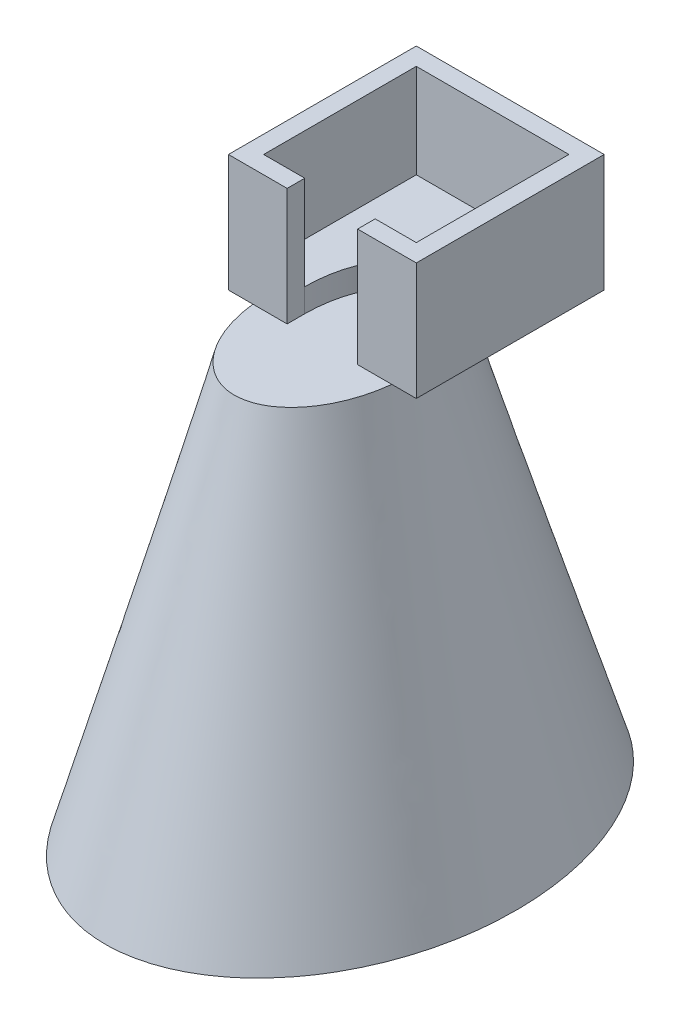
ISO-10303-21;
HEADER;
FILE_DESCRIPTION(('STEP AP214'),'2;1');
FILE_NAME('part.step','',(''),(''),'','','');
FILE_SCHEMA(('AUTOMOTIVE_DESIGN { 1 0 10303 214 1 1 1 1 }'));
ENDSEC;
DATA;
#1=APPLICATION_CONTEXT('core data for automotive mechanical design processes');
#2=APPLICATION_PROTOCOL_DEFINITION('international standard','automotive_design',2000,#1);
#3=PRODUCT_CONTEXT('',#1,'mechanical');
#4=PRODUCT('Part','Part','',(#3));
#5=PRODUCT_RELATED_PRODUCT_CATEGORY('part','',(#4));
#6=PRODUCT_DEFINITION_FORMATION('','',#4);
#7=PRODUCT_DEFINITION_CONTEXT('part definition',#1,'design');
#8=PRODUCT_DEFINITION('design','',#6,#7);
#9=PRODUCT_DEFINITION_SHAPE('','',#8);
#10=(LENGTH_UNIT() NAMED_UNIT(*) SI_UNIT(.MILLI.,.METRE.));
#11=(NAMED_UNIT(*) PLANE_ANGLE_UNIT() SI_UNIT($,.RADIAN.));
#12=(NAMED_UNIT(*) SI_UNIT($,.STERADIAN.) SOLID_ANGLE_UNIT());
#13=UNCERTAINTY_MEASURE_WITH_UNIT(LENGTH_MEASURE(1.E-05),#10,'distance_accuracy_value','');
#14=(GEOMETRIC_REPRESENTATION_CONTEXT(3) GLOBAL_UNCERTAINTY_ASSIGNED_CONTEXT((#13)) GLOBAL_UNIT_ASSIGNED_CONTEXT((#10,
#11,#12)) REPRESENTATION_CONTEXT('',''));
#15=CARTESIAN_POINT('',(0.,0.,0.));
#16=DIRECTION('',(0.,0.,1.));
#17=DIRECTION('',(1.,0.,0.));
#18=AXIS2_PLACEMENT_3D('',#15,#16,#17);
#19=CARTESIAN_POINT('',(-7.99999999999999,10.,8.));
#20=DIRECTION('',(0.,0.,-1.));
#21=DIRECTION('',(-1.,0.,0.));
#22=AXIS2_PLACEMENT_3D('',#19,#20,#21);
#23=PLANE('',#22);
#24=DIRECTION('',(0.,-1.,0.));
#25=VECTOR('',#24,1.);
#26=CARTESIAN_POINT('',(3.00000000000001,20.,8.));
#27=LINE('',#26,#25);
#28=CARTESIAN_POINT('',(3.00000000000001,10.,8.));
#29=VERTEX_POINT('',#28);
#30=CARTESIAN_POINT('',(3.00000000000001,0.,8.));
#31=VERTEX_POINT('',#30);
#32=EDGE_CURVE('E201',#29,#31,#27,.T.);
#33=ORIENTED_EDGE('',*,*,#32,.T.);
#34=DIRECTION('',(1.,0.,0.));
#35=VECTOR('',#34,1.);
#36=CARTESIAN_POINT('',(-7.99999999999999,0.,8.));
#37=LINE('',#36,#35);
#38=CARTESIAN_POINT('',(5.91632663334496,0.,7.9999661761987));
#39=VERTEX_POINT('',#38);
#40=EDGE_CURVE('E178',#31,#39,#37,.T.);
#41=ORIENTED_EDGE('',*,*,#40,.T.);
#42=CARTESIAN_POINT('',(8.00000000000001,0.,8.));
#43=VERTEX_POINT('',#42);
#44=EDGE_CURVE('E189',#39,#43,#37,.T.);
#45=ORIENTED_EDGE('',*,*,#44,.T.);
#46=DIRECTION('',(0.,-1.,0.));
#47=VECTOR('',#46,1.);
#48=CARTESIAN_POINT('',(8.00000000000001,10.,8.));
#49=LINE('',#48,#47);
#50=CARTESIAN_POINT('',(8.00000000000001,10.,8.));
#51=VERTEX_POINT('',#50);
#52=EDGE_CURVE('E214',#51,#43,#49,.T.);
#53=ORIENTED_EDGE('',*,*,#52,.F.);
#54=DIRECTION('',(1.,0.,0.));
#55=VECTOR('',#54,1.);
#56=CARTESIAN_POINT('',(-7.99999999999999,10.,8.));
#57=LINE('',#56,#55);
#58=EDGE_CURVE('E240',#29,#51,#57,.T.);
#59=ORIENTED_EDGE('',*,*,#58,.F.);
#60=EDGE_LOOP('',(#33,#41,#45,#53,#59));
#61=FACE_BOUND('',#60,.T.);
#62=ADVANCED_FACE('F61',(#61),#23,.F.);
#63=CARTESIAN_POINT('',(-6.5,2.,6.5));
#64=DIRECTION('',(0.,0.,1.));
#65=DIRECTION('',(1.,0.,0.));
#66=AXIS2_PLACEMENT_3D('',#63,#64,#65);
#67=PLANE('',#66);
#68=DIRECTION('',(0.,-1.,0.));
#69=VECTOR('',#68,1.);
#70=CARTESIAN_POINT('',(3.,20.,6.5));
#71=LINE('',#70,#69);
#72=CARTESIAN_POINT('',(3.,10.,6.5));
#73=VERTEX_POINT('',#72);
#74=CARTESIAN_POINT('',(3.,2.,6.5));
#75=VERTEX_POINT('',#74);
#76=EDGE_CURVE('E360',#73,#75,#71,.T.);
#77=ORIENTED_EDGE('',*,*,#76,.F.);
#78=DIRECTION('',(1.,0.,0.));
#79=VECTOR('',#78,1.);
#80=CARTESIAN_POINT('',(-6.5,10.,6.5));
#81=LINE('',#80,#79);
#82=CARTESIAN_POINT('',(6.5,10.,6.5));
#83=VERTEX_POINT('',#82);
#84=EDGE_CURVE('E277',#73,#83,#81,.T.);
#85=ORIENTED_EDGE('',*,*,#84,.T.);
#86=DIRECTION('',(0.,1.,0.));
#87=VECTOR('',#86,1.);
#88=CARTESIAN_POINT('',(6.5,2.,6.5));
#89=LINE('',#88,#87);
#90=CARTESIAN_POINT('',(6.5,2.,6.5));
#91=VERTEX_POINT('',#90);
#92=EDGE_CURVE('E247',#91,#83,#89,.T.);
#93=ORIENTED_EDGE('',*,*,#92,.F.);
#94=DIRECTION('',(1.,0.,0.));
#95=VECTOR('',#94,1.);
#96=CARTESIAN_POINT('',(-6.5,2.,6.5));
#97=LINE('',#96,#95);
#98=EDGE_CURVE('E306',#75,#91,#97,.T.);
#99=ORIENTED_EDGE('',*,*,#98,.F.);
#100=EDGE_LOOP('',(#77,#85,#93,#99));
#101=FACE_BOUND('',#100,.T.);
#102=ADVANCED_FACE('F395',(#101),#67,.F.);
#103=CARTESIAN_POINT('',(8.,10.,-8.));
#104=DIRECTION('',(-1.,0.,0.));
#105=DIRECTION('',(0.,0.,1.));
#106=AXIS2_PLACEMENT_3D('',#103,#104,#105);
#107=PLANE('',#106);
#108=DIRECTION('',(0.,0.,-1.));
#109=VECTOR('',#108,1.);
#110=CARTESIAN_POINT('',(8.,0.,-8.));
#111=LINE('',#110,#109);
#112=CARTESIAN_POINT('',(8.,0.,-8.));
#113=VERTEX_POINT('',#112);
#114=EDGE_CURVE('E192',#43,#113,#111,.T.);
#115=ORIENTED_EDGE('',*,*,#114,.T.);
#116=DIRECTION('',(0.,-1.,0.));
#117=VECTOR('',#116,1.);
#118=CARTESIAN_POINT('',(8.,10.,-8.));
#119=LINE('',#118,#117);
#120=CARTESIAN_POINT('',(8.,10.,-8.));
#121=VERTEX_POINT('',#120);
#122=EDGE_CURVE('E77',#121,#113,#119,.T.);
#123=ORIENTED_EDGE('',*,*,#122,.F.);
#124=DIRECTION('',(0.,0.,-1.));
#125=VECTOR('',#124,1.);
#126=CARTESIAN_POINT('',(8.,10.,-8.));
#127=LINE('',#126,#125);
#128=EDGE_CURVE('E221',#51,#121,#127,.T.);
#129=ORIENTED_EDGE('',*,*,#128,.F.);
#130=ORIENTED_EDGE('',*,*,#52,.T.);
#131=EDGE_LOOP('',(#115,#123,#129,#130));
#132=FACE_BOUND('',#131,.T.);
#133=ADVANCED_FACE('F63',(#132),#107,.F.);
#134=CARTESIAN_POINT('',(-8.,10.,-8.));
#135=DIRECTION('',(0.,0.,1.));
#136=DIRECTION('',(1.,0.,0.));
#137=AXIS2_PLACEMENT_3D('',#134,#135,#136);
#138=PLANE('',#137);
#139=DIRECTION('',(-1.,0.,0.));
#140=VECTOR('',#139,1.);
#141=CARTESIAN_POINT('',(-8.,0.,-8.));
#142=LINE('',#141,#140);
#143=CARTESIAN_POINT('',(-8.,0.,-8.));
#144=VERTEX_POINT('',#143);
#145=EDGE_CURVE('E246',#113,#144,#142,.T.);
#146=ORIENTED_EDGE('',*,*,#145,.T.);
#147=DIRECTION('',(0.,-1.,0.));
#148=VECTOR('',#147,1.);
#149=CARTESIAN_POINT('',(-8.,10.,-8.));
#150=LINE('',#149,#148);
#151=CARTESIAN_POINT('',(-8.,10.,-8.));
#152=VERTEX_POINT('',#151);
#153=EDGE_CURVE('E261',#152,#144,#150,.T.);
#154=ORIENTED_EDGE('',*,*,#153,.F.);
#155=DIRECTION('',(-1.,0.,0.));
#156=VECTOR('',#155,1.);
#157=CARTESIAN_POINT('',(-8.,10.,-8.));
#158=LINE('',#157,#156);
#159=EDGE_CURVE('E226',#121,#152,#158,.T.);
#160=ORIENTED_EDGE('',*,*,#159,.F.);
#161=ORIENTED_EDGE('',*,*,#122,.T.);
#162=EDGE_LOOP('',(#146,#154,#160,#161));
#163=FACE_BOUND('',#162,.T.);
#164=ADVANCED_FACE('F269',(#163),#138,.F.);
#165=CARTESIAN_POINT('',(-8.,10.,-8.));
#166=DIRECTION('',(1.,0.,0.));
#167=DIRECTION('',(0.,0.,-1.));
#168=AXIS2_PLACEMENT_3D('',#165,#166,#167);
#169=PLANE('',#168);
#170=DIRECTION('',(0.,0.,1.));
#171=VECTOR('',#170,1.);
#172=CARTESIAN_POINT('',(-8.,0.,-8.));
#173=LINE('',#172,#171);
#174=CARTESIAN_POINT('',(-7.99999999999999,0.,8.));
#175=VERTEX_POINT('',#174);
#176=EDGE_CURVE('E197',#144,#175,#173,.T.);
#177=ORIENTED_EDGE('',*,*,#176,.T.);
#178=DIRECTION('',(0.,-1.,0.));
#179=VECTOR('',#178,1.);
#180=CARTESIAN_POINT('',(-7.99999999999999,10.,8.));
#181=LINE('',#180,#179);
#182=CARTESIAN_POINT('',(-7.99999999999999,10.,8.));
#183=VERTEX_POINT('',#182);
#184=EDGE_CURVE('E259',#183,#175,#181,.T.);
#185=ORIENTED_EDGE('',*,*,#184,.F.);
#186=DIRECTION('',(0.,0.,1.));
#187=VECTOR('',#186,1.);
#188=CARTESIAN_POINT('',(-8.,10.,-8.));
#189=LINE('',#188,#187);
#190=EDGE_CURVE('E232',#152,#183,#189,.T.);
#191=ORIENTED_EDGE('',*,*,#190,.F.);
#192=ORIENTED_EDGE('',*,*,#153,.T.);
#193=EDGE_LOOP('',(#177,#185,#191,#192));
#194=FACE_BOUND('',#193,.T.);
#195=ADVANCED_FACE('F257',(#194),#169,.F.);
#196=CARTESIAN_POINT('',(-5.91632824516334,0.,7.99996585064522));
#197=VERTEX_POINT('',#196);
#198=EDGE_CURVE('E205',#175,#197,#37,.T.);
#199=ORIENTED_EDGE('',*,*,#198,.T.);
#200=CARTESIAN_POINT('',(-2.99999999999999,0.,8.));
#201=VERTEX_POINT('',#200);
#202=EDGE_CURVE('E181',#197,#201,#37,.T.);
#203=ORIENTED_EDGE('',*,*,#202,.T.);
#204=DIRECTION('',(0.,-1.,0.));
#205=VECTOR('',#204,1.);
#206=CARTESIAN_POINT('',(-2.99999999999999,20.,8.));
#207=LINE('',#206,#205);
#208=CARTESIAN_POINT('',(-2.99999999999999,10.,8.));
#209=VERTEX_POINT('',#208);
#210=EDGE_CURVE('E357',#209,#201,#207,.T.);
#211=ORIENTED_EDGE('',*,*,#210,.F.);
#212=EDGE_CURVE('E241',#183,#209,#57,.T.);
#213=ORIENTED_EDGE('',*,*,#212,.F.);
#214=ORIENTED_EDGE('',*,*,#184,.T.);
#215=EDGE_LOOP('',(#199,#203,#211,#213,#214));
#216=FACE_BOUND('',#215,.T.);
#217=ADVANCED_FACE('F262',(#216),#23,.F.);
#218=CARTESIAN_POINT('',(0.,10.,0.));
#219=DIRECTION('',(0.,1.,0.));
#220=DIRECTION('',(0.,0.,1.));
#221=AXIS2_PLACEMENT_3D('',#218,#219,#220);
#222=PLANE('',#221);
#223=DIRECTION('',(0.,0.,1.));
#224=VECTOR('',#223,1.);
#225=CARTESIAN_POINT('',(-2.99999999999999,10.,0.));
#226=LINE('',#225,#224);
#227=CARTESIAN_POINT('',(-2.99999999999999,10.,6.5));
#228=VERTEX_POINT('',#227);
#229=EDGE_CURVE('E282',#228,#209,#226,.T.);
#230=ORIENTED_EDGE('',*,*,#229,.F.);
#231=CARTESIAN_POINT('',(-6.5,10.,6.5));
#232=VERTEX_POINT('',#231);
#233=EDGE_CURVE('E298',#232,#228,#81,.T.);
#234=ORIENTED_EDGE('',*,*,#233,.F.);
#235=DIRECTION('',(0.,0.,1.));
#236=VECTOR('',#235,1.);
#237=CARTESIAN_POINT('',(-6.5,10.,-6.5));
#238=LINE('',#237,#236);
#239=CARTESIAN_POINT('',(-6.5,10.,-6.5));
#240=VERTEX_POINT('',#239);
#241=EDGE_CURVE('E317',#240,#232,#238,.T.);
#242=ORIENTED_EDGE('',*,*,#241,.F.);
#243=DIRECTION('',(-1.,0.,0.));
#244=VECTOR('',#243,1.);
#245=CARTESIAN_POINT('',(-6.5,10.,-6.5));
#246=LINE('',#245,#244);
#247=CARTESIAN_POINT('',(6.5,10.,-6.5));
#248=VERTEX_POINT('',#247);
#249=EDGE_CURVE('E313',#248,#240,#246,.T.);
#250=ORIENTED_EDGE('',*,*,#249,.F.);
#251=DIRECTION('',(0.,0.,-1.));
#252=VECTOR('',#251,1.);
#253=CARTESIAN_POINT('',(6.5,10.,-6.5));
#254=LINE('',#253,#252);
#255=EDGE_CURVE('E92',#83,#248,#254,.T.);
#256=ORIENTED_EDGE('',*,*,#255,.F.);
#257=ORIENTED_EDGE('',*,*,#84,.F.);
#258=DIRECTION('',(0.,0.,1.));
#259=VECTOR('',#258,1.);
#260=CARTESIAN_POINT('',(3.,10.,0.));
#261=LINE('',#260,#259);
#262=EDGE_CURVE('E276',#73,#29,#261,.T.);
#263=ORIENTED_EDGE('',*,*,#262,.T.);
#264=ORIENTED_EDGE('',*,*,#58,.T.);
#265=ORIENTED_EDGE('',*,*,#128,.T.);
#266=ORIENTED_EDGE('',*,*,#159,.T.);
#267=ORIENTED_EDGE('',*,*,#190,.T.);
#268=ORIENTED_EDGE('',*,*,#212,.T.);
#269=EDGE_LOOP('',(#230,#234,#242,#250,#256,#257,#263,#264,#265,#266,#267,#268));
#270=FACE_BOUND('',#269,.T.);
#271=ADVANCED_FACE('F274',(#270),#222,.T.);
#272=CARTESIAN_POINT('',(0.,0.,0.));
#273=DIRECTION('',(0.,1.,0.));
#274=DIRECTION('',(0.,0.,1.));
#275=AXIS2_PLACEMENT_3D('',#272,#273,#274);
#276=PLANE('',#275);
#277=ORIENTED_EDGE('',*,*,#44,.F.);
#278=CARTESIAN_POINT('',(5.91608664185094,0.,7.9999391333498));
#279=CARTESIAN_POINT('',(5.94017140288235,0.,7.78609038024352));
#280=CARTESIAN_POINT('',(5.95904546552678,0.,7.57166052341323));
#281=CARTESIAN_POINT('',(5.98644391586068,0.,7.14207451848397));
#282=CARTESIAN_POINT('',(5.99496516333955,0.,6.92691816985995));
#283=CARTESIAN_POINT('',(6.00171566487025,0.,6.49641442115934));
#284=CARTESIAN_POINT('',(5.99994343733068,0.,6.28106699804075));
#285=CARTESIAN_POINT('',(5.98603198853717,0.,5.84894008244443));
#286=CARTESIAN_POINT('',(5.97380795969563,0.,5.63216331019717));
#287=CARTESIAN_POINT('',(5.93880395442882,0.,5.19947922080942));
#288=CARTESIAN_POINT('',(5.91602494936533,0.,4.98357182550513));
#289=CARTESIAN_POINT('',(5.85976767065591,0.,4.55317921094382));
#290=CARTESIAN_POINT('',(5.82629034471933,0.,4.33869386743178));
#291=CARTESIAN_POINT('',(5.73473808088342,0.,3.83668621608732));
#292=CARTESIAN_POINT('',(5.6721535719133,0.,3.54997050537042));
#293=CARTESIAN_POINT('',(5.52629851549188,0.,2.98179871601563));
#294=CARTESIAN_POINT('',(5.44302601357507,0.,2.7003431370232));
#295=CARTESIAN_POINT('',(5.2550291978857,0.,2.1454472991375));
#296=CARTESIAN_POINT('',(5.15036003180417,0.,1.87198846019565));
#297=CARTESIAN_POINT('',(4.91820659509148,0.,1.33495666926248));
#298=CARTESIAN_POINT('',(4.79073240526889,0.,1.07137941120226));
#299=CARTESIAN_POINT('',(4.55859307485381,0.,0.644105355367625));
#300=CARTESIAN_POINT('',(4.4607297626715,0.,0.47669705296395));
#301=CARTESIAN_POINT('',(4.25383408452357,0.,0.148859599975521));
#302=CARTESIAN_POINT('',(4.14480018571711,0.,-0.0115685884752345));
#303=CARTESIAN_POINT('',(3.91521777880357,0.,-0.323769748141769));
#304=CARTESIAN_POINT('',(3.79468119884094,0.,-0.475551430290298));
#305=CARTESIAN_POINT('',(3.54168515895169,0.,-0.768741794228157));
#306=CARTESIAN_POINT('',(3.40922812990479,0.,-0.910152580277381));
#307=CARTESIAN_POINT('',(3.06135102671966,0.,-1.24939373818852));
#308=CARTESIAN_POINT('',(2.83798631049277,0.,-1.43936147917797));
#309=CARTESIAN_POINT('',(2.48271078916535,0.,-1.69574523783265));
#310=CARTESIAN_POINT('',(2.36093706763078,0.,-1.77643366972574));
#311=CARTESIAN_POINT('',(2.11086872129758,0.,-1.92705830771189));
#312=CARTESIAN_POINT('',(1.98257534415352,0.,-1.99699656081369));
#313=CARTESIAN_POINT('',(1.74363514933324,0.,-2.11326119066615));
#314=CARTESIAN_POINT('',(1.63395124909799,0.,-2.16157263734053));
#315=CARTESIAN_POINT('',(1.41107863866039,0.,-2.249272667177));
#316=CARTESIAN_POINT('',(1.29789065988021,0.,-2.28866309837779));
#317=CARTESIAN_POINT('',(1.06866493694978,0.,-2.3578289857586));
#318=CARTESIAN_POINT('',(0.952628623153739,0.,-2.38760916578779));
#319=CARTESIAN_POINT('',(0.718400706734653,0.,-2.43701529594141));
#320=CARTESIAN_POINT('',(0.600209035740107,0.,-2.45664092336453));
#321=CARTESIAN_POINT('',(0.362080539108123,0.,-2.48539067028169));
#322=CARTESIAN_POINT('',(0.242138698238753,0.,-2.4944734469646));
#323=CARTESIAN_POINT('',(0.00193511867273593,0.,-2.50180291614116));
#324=CARTESIAN_POINT('',(-0.118326586138922,0.,-2.500050714058));
#325=CARTESIAN_POINT('',(-0.358192444726062,0.,-2.48575178762662));
#326=CARTESIAN_POINT('',(-0.477796655927855,0.,-2.47320602157589));
#327=CARTESIAN_POINT('',(-0.715475067026538,0.,-2.43757930030882));
#328=CARTESIAN_POINT('',(-0.833548558487565,0.,-2.41449363436568));
#329=CARTESIAN_POINT('',(-1.06054622191114,0.,-2.35987031831218));
#330=CARTESIAN_POINT('',(-1.16960645350094,0.,-2.32889409420785));
#331=CARTESIAN_POINT('',(-1.38500413205518,0.,-2.25849970666101));
#332=CARTESIAN_POINT('',(-1.4913405440466,0.,-2.2190783860733));
#333=CARTESIAN_POINT('',(-1.70084369142926,0.,-2.13235987087758));
#334=CARTESIAN_POINT('',(-1.80400777413345,0.,-2.08505628649268));
#335=CARTESIAN_POINT('',(-2.00671702968329,0.,-1.98322854420948));
#336=CARTESIAN_POINT('',(-2.10626141790899,0.,-1.92870283256498));
#337=CARTESIAN_POINT('',(-2.34312863171677,0.,-1.78838697907108));
#338=CARTESIAN_POINT('',(-2.47844061392049,0.,-1.69918608501513));
#339=CARTESIAN_POINT('',(-2.74051098814878,0.,-1.50932169250909));
#340=CARTESIAN_POINT('',(-2.86727692384197,0.,-1.4086685197789));
#341=CARTESIAN_POINT('',(-3.11251987946076,0.,-1.19724600423824));
#342=CARTESIAN_POINT('',(-3.23097835560425,0.,-1.08645522721388));
#343=CARTESIAN_POINT('',(-3.45936750081823,0.,-0.856381275093697));
#344=CARTESIAN_POINT('',(-3.56929521776524,0.,-0.737095187285425));
#345=CARTESIAN_POINT('',(-3.82679804551249,0.,-0.437801527227702));
#346=CARTESIAN_POINT('',(-3.96993333132045,0.,-0.253963433407997));
#347=CARTESIAN_POINT('',(-4.23962257681065,0.,0.125476027955091));
#348=CARTESIAN_POINT('',(-4.36617085762946,0.,0.321081390971094));
#349=CARTESIAN_POINT('',(-4.6036599459268,0.,0.721920461966896));
#350=CARTESIAN_POINT('',(-4.71457612849882,0.,0.927168696826578));
#351=CARTESIAN_POINT('',(-4.9213496366617,0.,1.34505879632276));
#352=CARTESIAN_POINT('',(-5.01720703229928,0.,1.55770062656195));
#353=CARTESIAN_POINT('',(-5.23262738823386,0.,2.08127218761929));
#354=CARTESIAN_POINT('',(-5.34474969717279,0.,2.39527766418788));
#355=CARTESIAN_POINT('',(-5.54155398731308,0.,3.03181785856854));
#356=CARTESIAN_POINT('',(-5.62622319148602,0.,3.35435647249827));
#357=CARTESIAN_POINT('',(-5.76941640169646,0.,4.0052848433487));
#358=CARTESIAN_POINT('',(-5.82793080227545,0.,4.33367670393227));
#359=CARTESIAN_POINT('',(-5.91964828334562,0.,4.99380812679624));
#360=CARTESIAN_POINT('',(-5.9528601036767,0.,5.32554649299601));
#361=CARTESIAN_POINT('',(-5.99818148956677,0.,6.04908974091911));
#362=CARTESIAN_POINT('',(-6.00555766585133,0.,6.44120659387296));
#363=CARTESIAN_POINT('',(-5.99108629710327,0.,7.02777238223663));
#364=CARTESIAN_POINT('',(-5.98205168623901,0.,7.22262254980876));
#365=CARTESIAN_POINT('',(-5.95547038175352,0.,7.6117780205774));
#366=CARTESIAN_POINT('',(-5.93792207035303,0.,7.80608321315668));
#367=CARTESIAN_POINT('',(-5.91608669828334,0.,7.99993863254083));
#368=B_SPLINE_CURVE_WITH_KNOTS('',3,(#278,#279,#280,#281,#282,#283,#284,#285,#286,#287,#288,
#289,#290,#291,#292,#293,#294,#295,#296,#297,#298,#299,#300,#301,#302,#303,#304,#305,#306,#307,
#308,#309,#310,#311,#312,#313,#314,#315,#316,#317,#318,#319,#320,#321,#322,#323,#324,#325,#326,
#327,#328,#329,#330,#331,#332,#333,#334,#335,#336,#337,#338,#339,#340,#341,#342,#343,#344,#345,
#346,#347,#348,#349,#350,#351,#352,#353,#354,#355,#356,#357,#358,#359,#360,#361,#362,#363,#364,
#365,#366,#367),.UNSPECIFIED.,.F.,.F.,(4,2,2,2,2,2,2,2,2,2,2,2,2,2,2,2,2,2,2,2,2,2,2,2,2,2,2,2,
2,2,2,2,2,2,2,2,2,2,2,2,2,2,2,2,4),(0.,0.645530106974631,1.29125596696733,1.93707477181964,
2.58818413102258,3.2392335813116,3.89022537445065,4.76986433699997,5.64958643367489,
6.52706909585214,7.40416482681416,7.98552144605967,8.5669579468558,9.14779792461473,
9.72851972172061,10.6044527156858,11.0422674584651,11.4799987306512,11.8392061022608,
12.1983389938336,12.5572950863988,12.9162625855214,13.2766330369831,13.6369667227723,
13.9972684199392,14.3577313090462,14.6974964731963,15.0373888787284,15.3775581714414,
15.7178007663565,16.2032722366765,16.6883094089925,17.1743969117468,17.6606518849287,
18.3585565794531,19.0566995936936,19.7559303707828,20.4551578952681,21.4539792129713,
22.453264729927,23.4529169376449,24.452223695758,25.6271226146317,26.212144084681,
26.7972767644796),.UNSPECIFIED.);
#369=EDGE_CURVE('E12',#39,#197,#368,.T.);
#370=ORIENTED_EDGE('',*,*,#369,.T.);
#371=ORIENTED_EDGE('',*,*,#198,.F.);
#372=ORIENTED_EDGE('',*,*,#176,.F.);
#373=ORIENTED_EDGE('',*,*,#145,.F.);
#374=ORIENTED_EDGE('',*,*,#114,.F.);
#375=EDGE_LOOP('',(#277,#370,#371,#372,#373,#374));
#376=FACE_BOUND('',#375,.T.);
#377=ADVANCED_FACE('F190',(#376),#276,.F.);
#378=CARTESIAN_POINT('',(6.5,2.,-6.5));
#379=DIRECTION('',(1.,0.,0.));
#380=DIRECTION('',(0.,0.,-1.));
#381=AXIS2_PLACEMENT_3D('',#378,#379,#380);
#382=PLANE('',#381);
#383=ORIENTED_EDGE('',*,*,#255,.T.);
#384=DIRECTION('',(0.,1.,0.));
#385=VECTOR('',#384,1.);
#386=CARTESIAN_POINT('',(6.5,2.,-6.5));
#387=LINE('',#386,#385);
#388=CARTESIAN_POINT('',(6.5,2.,-6.5));
#389=VERTEX_POINT('',#388);
#390=EDGE_CURVE('E235',#389,#248,#387,.T.);
#391=ORIENTED_EDGE('',*,*,#390,.F.);
#392=DIRECTION('',(0.,0.,-1.));
#393=VECTOR('',#392,1.);
#394=CARTESIAN_POINT('',(6.5,2.,-6.5));
#395=LINE('',#394,#393);
#396=EDGE_CURVE('E293',#91,#389,#395,.T.);
#397=ORIENTED_EDGE('',*,*,#396,.F.);
#398=ORIENTED_EDGE('',*,*,#92,.T.);
#399=EDGE_LOOP('',(#383,#391,#397,#398));
#400=FACE_BOUND('',#399,.T.);
#401=ADVANCED_FACE('F394',(#400),#382,.F.);
#402=ORIENTED_EDGE('',*,*,#233,.T.);
#403=DIRECTION('',(0.,-1.,0.));
#404=VECTOR('',#403,1.);
#405=CARTESIAN_POINT('',(-2.99999999999999,20.,6.5));
#406=LINE('',#405,#404);
#407=CARTESIAN_POINT('',(-3.,2.,6.5));
#408=VERTEX_POINT('',#407);
#409=EDGE_CURVE('E283',#228,#408,#406,.T.);
#410=ORIENTED_EDGE('',*,*,#409,.T.);
#411=CARTESIAN_POINT('',(-6.5,2.,6.5));
#412=VERTEX_POINT('',#411);
#413=EDGE_CURVE('E307',#412,#408,#97,.T.);
#414=ORIENTED_EDGE('',*,*,#413,.F.);
#415=DIRECTION('',(0.,1.,0.));
#416=VECTOR('',#415,1.);
#417=CARTESIAN_POINT('',(-6.5,2.,6.5));
#418=LINE('',#417,#416);
#419=EDGE_CURVE('E326',#412,#232,#418,.T.);
#420=ORIENTED_EDGE('',*,*,#419,.T.);
#421=EDGE_LOOP('',(#402,#410,#414,#420));
#422=FACE_BOUND('',#421,.T.);
#423=ADVANCED_FACE('F346',(#422),#67,.F.);
#424=CARTESIAN_POINT('',(-6.5,2.,-6.5));
#425=DIRECTION('',(-1.,0.,0.));
#426=DIRECTION('',(0.,0.,1.));
#427=AXIS2_PLACEMENT_3D('',#424,#425,#426);
#428=PLANE('',#427);
#429=ORIENTED_EDGE('',*,*,#241,.T.);
#430=ORIENTED_EDGE('',*,*,#419,.F.);
#431=DIRECTION('',(0.,0.,1.));
#432=VECTOR('',#431,1.);
#433=CARTESIAN_POINT('',(-6.5,2.,-6.5));
#434=LINE('',#433,#432);
#435=CARTESIAN_POINT('',(-6.5,2.,-6.5));
#436=VERTEX_POINT('',#435);
#437=EDGE_CURVE('E302',#436,#412,#434,.T.);
#438=ORIENTED_EDGE('',*,*,#437,.F.);
#439=DIRECTION('',(0.,1.,0.));
#440=VECTOR('',#439,1.);
#441=CARTESIAN_POINT('',(-6.5,2.,-6.5));
#442=LINE('',#441,#440);
#443=EDGE_CURVE('E328',#436,#240,#442,.T.);
#444=ORIENTED_EDGE('',*,*,#443,.T.);
#445=EDGE_LOOP('',(#429,#430,#438,#444));
#446=FACE_BOUND('',#445,.T.);
#447=ADVANCED_FACE('F340',(#446),#428,.F.);
#448=CARTESIAN_POINT('',(-6.5,2.,-6.5));
#449=DIRECTION('',(0.,0.,-1.));
#450=DIRECTION('',(-1.,0.,0.));
#451=AXIS2_PLACEMENT_3D('',#448,#449,#450);
#452=PLANE('',#451);
#453=ORIENTED_EDGE('',*,*,#249,.T.);
#454=ORIENTED_EDGE('',*,*,#443,.F.);
#455=DIRECTION('',(-1.,0.,0.));
#456=VECTOR('',#455,1.);
#457=CARTESIAN_POINT('',(-6.5,2.,-6.5));
#458=LINE('',#457,#456);
#459=EDGE_CURVE('E297',#389,#436,#458,.T.);
#460=ORIENTED_EDGE('',*,*,#459,.F.);
#461=ORIENTED_EDGE('',*,*,#390,.T.);
#462=EDGE_LOOP('',(#453,#454,#460,#461));
#463=FACE_BOUND('',#462,.T.);
#464=ADVANCED_FACE('F336',(#463),#452,.F.);
#465=CARTESIAN_POINT('',(0.,2.,0.));
#466=DIRECTION('',(0.,1.,0.));
#467=DIRECTION('',(0.,0.,1.));
#468=AXIS2_PLACEMENT_3D('',#465,#466,#467);
#469=PLANE('',#468);
#470=CARTESIAN_POINT('',(0.,2.,6.5));
#471=DIRECTION('',(0.,-1.,0.));
#472=DIRECTION('',(0.,0.,-1.));
#473=AXIS2_PLACEMENT_3D('',#470,#471,#472);
#474=ELLIPSE('',#473,6.,3.);
#475=EDGE_CURVE('E372',#75,#408,#474,.F.);
#476=ORIENTED_EDGE('',*,*,#475,.F.);
#477=ORIENTED_EDGE('',*,*,#98,.T.);
#478=ORIENTED_EDGE('',*,*,#396,.T.);
#479=ORIENTED_EDGE('',*,*,#459,.T.);
#480=ORIENTED_EDGE('',*,*,#437,.T.);
#481=ORIENTED_EDGE('',*,*,#413,.T.);
#482=EDGE_LOOP('',(#476,#477,#478,#479,#480,#481));
#483=FACE_BOUND('',#482,.T.);
#484=ADVANCED_FACE('F345',(#483),#469,.T.);
#485=CARTESIAN_POINT('',(-2.99999999999999,20.,0.));
#486=DIRECTION('',(-1.,0.,0.));
#487=DIRECTION('',(0.,0.,1.));
#488=AXIS2_PLACEMENT_3D('',#485,#486,#487);
#489=PLANE('',#488);
#490=ORIENTED_EDGE('',*,*,#229,.T.);
#491=ORIENTED_EDGE('',*,*,#210,.T.);
#492=DIRECTION('',(0.,0.,-1.));
#493=VECTOR('',#492,1.);
#494=CARTESIAN_POINT('',(-2.99999999999999,0.,0.));
#495=LINE('',#494,#493);
#496=CARTESIAN_POINT('',(-2.99999999999999,0.,6.49999999999999));
#497=VERTEX_POINT('',#496);
#498=EDGE_CURVE('E353',#201,#497,#495,.T.);
#499=ORIENTED_EDGE('',*,*,#498,.T.);
#500=EDGE_CURVE('E289',#408,#497,#406,.T.);
#501=ORIENTED_EDGE('',*,*,#500,.F.);
#502=ORIENTED_EDGE('',*,*,#409,.F.);
#503=EDGE_LOOP('',(#490,#491,#499,#501,#502));
#504=FACE_BOUND('',#503,.T.);
#505=ADVANCED_FACE('F349',(#504),#489,.F.);
#506=CARTESIAN_POINT('',(3.,20.,0.));
#507=DIRECTION('',(-1.,0.,0.));
#508=DIRECTION('',(0.,0.,1.));
#509=AXIS2_PLACEMENT_3D('',#506,#507,#508);
#510=PLANE('',#509);
#511=ORIENTED_EDGE('',*,*,#76,.T.);
#512=CARTESIAN_POINT('',(3.,0.,6.5));
#513=VERTEX_POINT('',#512);
#514=EDGE_CURVE('E363',#75,#513,#71,.T.);
#515=ORIENTED_EDGE('',*,*,#514,.T.);
#516=DIRECTION('',(0.,0.,-1.));
#517=VECTOR('',#516,1.);
#518=CARTESIAN_POINT('',(3.,0.,0.));
#519=LINE('',#518,#517);
#520=EDGE_CURVE('E367',#31,#513,#519,.T.);
#521=ORIENTED_EDGE('',*,*,#520,.F.);
#522=ORIENTED_EDGE('',*,*,#32,.F.);
#523=ORIENTED_EDGE('',*,*,#262,.F.);
#524=EDGE_LOOP('',(#511,#515,#521,#522,#523));
#525=FACE_BOUND('',#524,.T.);
#526=ADVANCED_FACE('F384',(#525),#510,.T.);
#527=CARTESIAN_POINT('',(0.,20.,6.5));
#528=DIRECTION('',(0.,-1.,0.));
#529=DIRECTION('',(0.,0.,-1.));
#530=AXIS2_PLACEMENT_3D('',#527,#528,#529);
#531=ELLIPSE('',#530,6.,3.);
#532=DIRECTION('',(0.,-1.,0.));
#533=VECTOR('',#532,1.);
#534=SURFACE_OF_LINEAR_EXTRUSION('',#531,#533);
#535=CARTESIAN_POINT('',(0.,0.,6.5));
#536=DIRECTION('',(0.,-1.,0.));
#537=DIRECTION('',(0.,0.,-1.));
#538=AXIS2_PLACEMENT_3D('',#535,#536,#537);
#539=ELLIPSE('',#538,6.,3.);
#540=EDGE_CURVE('E183',#497,#513,#539,.T.);
#541=ORIENTED_EDGE('',*,*,#540,.T.);
#542=ORIENTED_EDGE('',*,*,#514,.F.);
#543=ORIENTED_EDGE('',*,*,#475,.T.);
#544=ORIENTED_EDGE('',*,*,#500,.T.);
#545=EDGE_LOOP('',(#541,#542,#543,#544));
#546=FACE_BOUND('',#545,.T.);
#547=ADVANCED_FACE('F380',(#546),#534,.F.);
#548=CARTESIAN_POINT('',(0.,0.,6.5));
#549=DIRECTION('',(0.,-1.,0.));
#550=DIRECTION('',(0.,0.,-1.));
#551=AXIS2_PLACEMENT_3D('',#548,#549,#550);
#552=PLANE('',#551);
#553=ORIENTED_EDGE('',*,*,#202,.F.);
#554=CARTESIAN_POINT('',(0.,0.,6.5));
#555=DIRECTION('',(0.,-1.,0.));
#556=DIRECTION('',(0.,0.,-1.));
#557=AXIS2_PLACEMENT_3D('',#554,#555,#556);
#558=ELLIPSE('',#557,9.,6.);
#559=EDGE_CURVE('E83',#39,#197,#558,.T.);
#560=ORIENTED_EDGE('',*,*,#559,.F.);
#561=ORIENTED_EDGE('',*,*,#40,.F.);
#562=ORIENTED_EDGE('',*,*,#520,.T.);
#563=ORIENTED_EDGE('',*,*,#540,.F.);
#564=ORIENTED_EDGE('',*,*,#498,.F.);
#565=EDGE_LOOP('',(#553,#560,#561,#562,#563,#564));
#566=FACE_BOUND('',#565,.T.);
#567=ADVANCED_FACE('F176',(#566),#552,.F.);
#568=CARTESIAN_POINT('',(0.,-35.,6.5));
#569=DIRECTION('',(0.,1.,0.));
#570=DIRECTION('',(0.,0.,1.));
#571=AXIS2_PLACEMENT_3D('',#568,#569,#570);
#572=PLANE('',#571);
#573=CARTESIAN_POINT('',(0.,-35.,6.5));
#574=DIRECTION('',(0.,1.,0.));
#575=DIRECTION('',(0.,0.,-1.));
#576=AXIS2_PLACEMENT_3D('',#573,#574,#575);
#577=ELLIPSE('',#576,20.,15.);
#578=CARTESIAN_POINT('',(0.,-35.,-13.5));
#579=VERTEX_POINT('',#578);
#580=EDGE_CURVE('E184',#579,#579,#577,.T.);
#581=ORIENTED_EDGE('',*,*,#580,.F.);
#582=EDGE_LOOP('',(#581));
#583=FACE_BOUND('',#582,.T.);
#584=ADVANCED_FACE('F436',(#583),#572,.F.);
#585=CARTESIAN_POINT('',(-9.64823024010698,-35.,-8.81370646672873));
#586=CARTESIAN_POINT('',(-4.99404764304398,0.,1.51162869136976));
#587=CARTESIAN_POINT('',(-32.6187899402001,-35.,16.9149075068899));
#588=CARTESIAN_POINT('',(-11.6452093878843,0.,16.4937716205017));
#589=CARTESIAN_POINT('',(-13.3223294599861,-35.,47.5423204403473));
#590=CARTESIAN_POINT('',(-1.65711410179632,0.,26.4705142377622));
#591=CARTESIAN_POINT('',(9.64823024010699,-35.,21.8137064667287));
#592=CARTESIAN_POINT('',(4.99404764304399,0.,11.4883713086302));
#593=CARTESIAN_POINT('',(32.6187899402001,-35.,-3.9149075068899));
#594=CARTESIAN_POINT('',(11.6452093878843,0.,-3.49377162050171));
#595=CARTESIAN_POINT('',(13.3223294599861,-35.,-34.5423204403474));
#596=CARTESIAN_POINT('',(1.65711410179633,0.,-13.4705142377622));
#597=CARTESIAN_POINT('',(-9.64823024010698,-35.,-8.81370646672873));
#598=CARTESIAN_POINT('',(-4.99404764304398,0.,1.51162869136976));
#599=(BOUNDED_SURFACE() B_SPLINE_SURFACE(3,1,((#585,#586),(#587,#588),(#589,#590),(#591,#592),
(#593,#594),(#595,#596),(#597,#598)),.UNSPECIFIED.,.T.,.F.,.F.) B_SPLINE_SURFACE_WITH_KNOTS((4,
3,4),(2,2),(0.,0.5,1.),(0.,1.),
.UNSPECIFIED.) GEOMETRIC_REPRESENTATION_ITEM() RATIONAL_B_SPLINE_SURFACE(((1.,1.),
(0.333333333333333,0.333333333333333),(0.333333333333333,0.333333333333333),(1.,1.),
(0.333333333333333,0.333333333333334),(0.333333333333333,0.333333333333334),(1.,1.))) REPRESENTATION_ITEM('') SURFACE());
#600=ORIENTED_EDGE('',*,*,#580,.T.);
#601=EDGE_LOOP('',(#600));
#602=FACE_BOUND('',#601,.T.);
#603=ORIENTED_EDGE('',*,*,#559,.T.);
#604=ORIENTED_EDGE('',*,*,#369,.F.);
#605=EDGE_LOOP('',(#603,#604));
#606=FACE_BOUND('',#605,.T.);
#607=ADVANCED_FACE('F169',(#602,#606),#599,.T.);
#608=CLOSED_SHELL('',(#62,#102,#133,#164,#195,#217,#271,#377,#401,#423,#447,#464,#484,#505,#526,
#547,#567,#584,#607));
#609=MANIFOLD_SOLID_BREP('B2',#608);
#610=ADVANCED_BREP_SHAPE_REPRESENTATION('',(#18,#609),#14);
#611=SHAPE_DEFINITION_REPRESENTATION(#9,#610);
ENDSEC;
END-ISO-10303-21;
